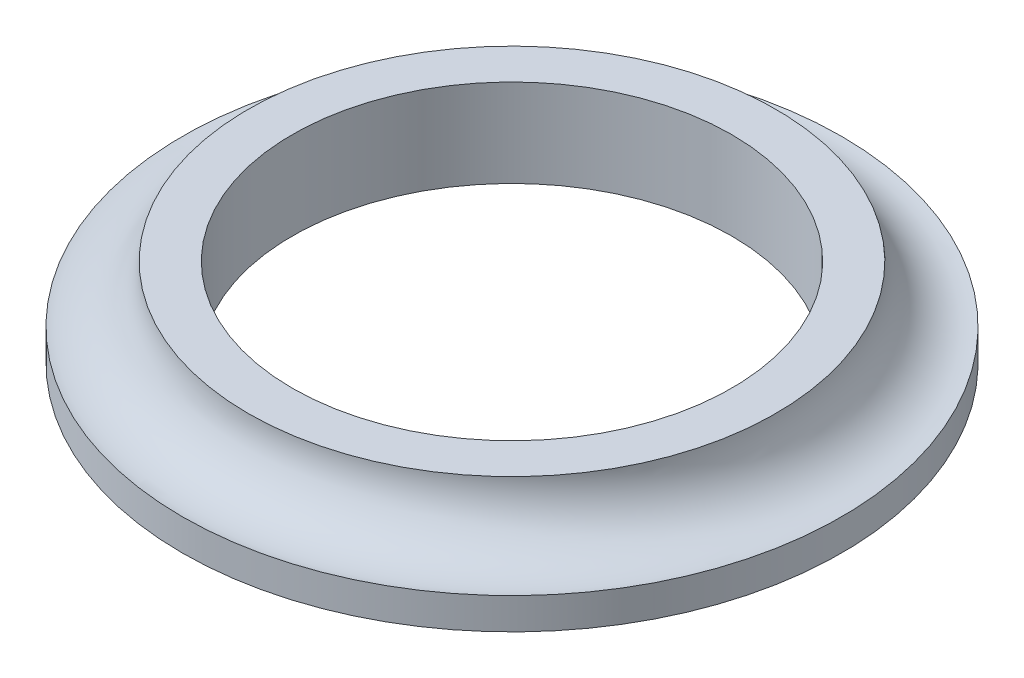
ISO-10303-21;
HEADER;
FILE_DESCRIPTION(('STEP AP214'),'2;1');
FILE_NAME('part.step','',(''),(''),'','','');
FILE_SCHEMA(('AUTOMOTIVE_DESIGN { 1 0 10303 214 1 1 1 1 }'));
ENDSEC;
DATA;
#1=APPLICATION_CONTEXT('core data for automotive mechanical design processes');
#2=APPLICATION_PROTOCOL_DEFINITION('international standard','automotive_design',2000,#1);
#3=PRODUCT_CONTEXT('',#1,'mechanical');
#4=PRODUCT('Part','Part','',(#3));
#5=PRODUCT_RELATED_PRODUCT_CATEGORY('part','',(#4));
#6=PRODUCT_DEFINITION_FORMATION('','',#4);
#7=PRODUCT_DEFINITION_CONTEXT('part definition',#1,'design');
#8=PRODUCT_DEFINITION('design','',#6,#7);
#9=PRODUCT_DEFINITION_SHAPE('','',#8);
#10=(LENGTH_UNIT() NAMED_UNIT(*) SI_UNIT(.MILLI.,.METRE.));
#11=(NAMED_UNIT(*) PLANE_ANGLE_UNIT() SI_UNIT($,.RADIAN.));
#12=(NAMED_UNIT(*) SI_UNIT($,.STERADIAN.) SOLID_ANGLE_UNIT());
#13=UNCERTAINTY_MEASURE_WITH_UNIT(LENGTH_MEASURE(1.E-05),#10,'distance_accuracy_value','');
#14=(GEOMETRIC_REPRESENTATION_CONTEXT(3) GLOBAL_UNCERTAINTY_ASSIGNED_CONTEXT((#13)) GLOBAL_UNIT_ASSIGNED_CONTEXT((#10,
#11,#12)) REPRESENTATION_CONTEXT('',''));
#15=CARTESIAN_POINT('',(0.,0.,0.));
#16=DIRECTION('',(0.,0.,1.));
#17=DIRECTION('',(1.,0.,0.));
#18=AXIS2_PLACEMENT_3D('',#15,#16,#17);
#19=CARTESIAN_POINT('',(0.,5.42389387322616,25.));
#20=DIRECTION('',(0.,1.,0.));
#21=DIRECTION('',(0.,0.,1.));
#22=AXIS2_PLACEMENT_3D('',#19,#20,#21);
#23=PLANE('',#22);
#24=CARTESIAN_POINT('',(0.,5.42389387322614,0.));
#25=DIRECTION('',(0.,1.,0.));
#26=DIRECTION('',(0.,0.,1.));
#27=AXIS2_PLACEMENT_3D('',#24,#25,#26);
#28=CIRCLE('',#27,30.);
#29=CARTESIAN_POINT('',(0.,5.42389387322614,30.));
#30=VERTEX_POINT('',#29);
#31=EDGE_CURVE('E10',#30,#30,#28,.T.);
#32=ORIENTED_EDGE('',*,*,#31,.T.);
#33=EDGE_LOOP('',(#32));
#34=FACE_BOUND('',#33,.T.);
#35=CARTESIAN_POINT('',(0.,5.42389387322617,0.));
#36=DIRECTION('',(0.,1.,0.));
#37=DIRECTION('',(0.,0.,1.));
#38=AXIS2_PLACEMENT_3D('',#35,#36,#37);
#39=CIRCLE('',#38,25.);
#40=CARTESIAN_POINT('',(0.,5.42389387322617,25.));
#41=VERTEX_POINT('',#40);
#42=EDGE_CURVE('E50',#41,#41,#39,.T.);
#43=ORIENTED_EDGE('',*,*,#42,.F.);
#44=EDGE_LOOP('',(#43));
#45=FACE_BOUND('',#44,.T.);
#46=ADVANCED_FACE('F31',(#34,#45),#23,.T.);
#47=CARTESIAN_POINT('',(0.,5.42389387322616,0.));
#48=DIRECTION('',(0.,1.,0.));
#49=DIRECTION('',(0.,0.,1.));
#50=AXIS2_PLACEMENT_3D('',#47,#48,#49);
#51=TOROIDAL_SURFACE('',#50,36.5,6.5);
#52=CARTESIAN_POINT('',(0.,-0.998722416106407,0.));
#53=DIRECTION('',(0.,1.,0.));
#54=DIRECTION('',(0.,0.,1.));
#55=AXIS2_PLACEMENT_3D('',#52,#53,#54);
#56=CIRCLE('',#55,37.5);
#57=CARTESIAN_POINT('',(0.,-0.998722416106407,37.5));
#58=VERTEX_POINT('',#57);
#59=EDGE_CURVE('E37',#58,#58,#56,.T.);
#60=ORIENTED_EDGE('',*,*,#59,.T.);
#61=EDGE_LOOP('',(#60));
#62=FACE_BOUND('',#61,.T.);
#63=ORIENTED_EDGE('',*,*,#31,.F.);
#64=EDGE_LOOP('',(#63));
#65=FACE_BOUND('',#64,.T.);
#66=ADVANCED_FACE('F58',(#62,#65),#51,.F.);
#67=CARTESIAN_POINT('',(0.,212.009913498955,0.));
#68=DIRECTION('',(0.,1.,0.));
#69=DIRECTION('',(0.,0.,1.));
#70=AXIS2_PLACEMENT_3D('',#67,#68,#69);
#71=CYLINDRICAL_SURFACE('',#70,37.5);
#72=CARTESIAN_POINT('',(0.,-4.57610612677384,0.));
#73=DIRECTION('',(0.,1.,0.));
#74=DIRECTION('',(0.,0.,1.));
#75=AXIS2_PLACEMENT_3D('',#72,#73,#74);
#76=CIRCLE('',#75,37.5);
#77=CARTESIAN_POINT('',(0.,-4.57610612677384,37.5));
#78=VERTEX_POINT('',#77);
#79=EDGE_CURVE('E41',#78,#78,#76,.T.);
#80=ORIENTED_EDGE('',*,*,#79,.T.);
#81=EDGE_LOOP('',(#80));
#82=FACE_BOUND('',#81,.T.);
#83=ORIENTED_EDGE('',*,*,#59,.F.);
#84=EDGE_LOOP('',(#83));
#85=FACE_BOUND('',#84,.T.);
#86=ADVANCED_FACE('F62',(#82,#85),#71,.T.);
#87=CARTESIAN_POINT('',(0.,-4.57610612677384,25.));
#88=DIRECTION('',(0.,-1.,0.));
#89=DIRECTION('',(0.,0.,-1.));
#90=AXIS2_PLACEMENT_3D('',#87,#88,#89);
#91=PLANE('',#90);
#92=CARTESIAN_POINT('',(0.,-4.57610612677384,0.));
#93=DIRECTION('',(0.,1.,0.));
#94=DIRECTION('',(0.,0.,1.));
#95=AXIS2_PLACEMENT_3D('',#92,#93,#94);
#96=CIRCLE('',#95,25.);
#97=CARTESIAN_POINT('',(0.,-4.57610612677384,25.));
#98=VERTEX_POINT('',#97);
#99=EDGE_CURVE('E45',#98,#98,#96,.T.);
#100=ORIENTED_EDGE('',*,*,#99,.T.);
#101=EDGE_LOOP('',(#100));
#102=FACE_BOUND('',#101,.T.);
#103=ORIENTED_EDGE('',*,*,#79,.F.);
#104=EDGE_LOOP('',(#103));
#105=FACE_BOUND('',#104,.T.);
#106=ADVANCED_FACE('F66',(#102,#105),#91,.T.);
#107=CARTESIAN_POINT('',(0.,212.009913498955,0.));
#108=DIRECTION('',(0.,1.,0.));
#109=DIRECTION('',(0.,0.,1.));
#110=AXIS2_PLACEMENT_3D('',#107,#108,#109);
#111=CYLINDRICAL_SURFACE('',#110,25.);
#112=ORIENTED_EDGE('',*,*,#42,.T.);
#113=EDGE_LOOP('',(#112));
#114=FACE_BOUND('',#113,.T.);
#115=ORIENTED_EDGE('',*,*,#99,.F.);
#116=EDGE_LOOP('',(#115));
#117=FACE_BOUND('',#116,.T.);
#118=ADVANCED_FACE('F54',(#114,#117),#111,.F.);
#119=CLOSED_SHELL('',(#46,#66,#86,#106,#118));
#120=MANIFOLD_SOLID_BREP('B2',#119);
#121=ADVANCED_BREP_SHAPE_REPRESENTATION('',(#18,#120),#14);
#122=SHAPE_DEFINITION_REPRESENTATION(#9,#121);
ENDSEC;
END-ISO-10303-21;
